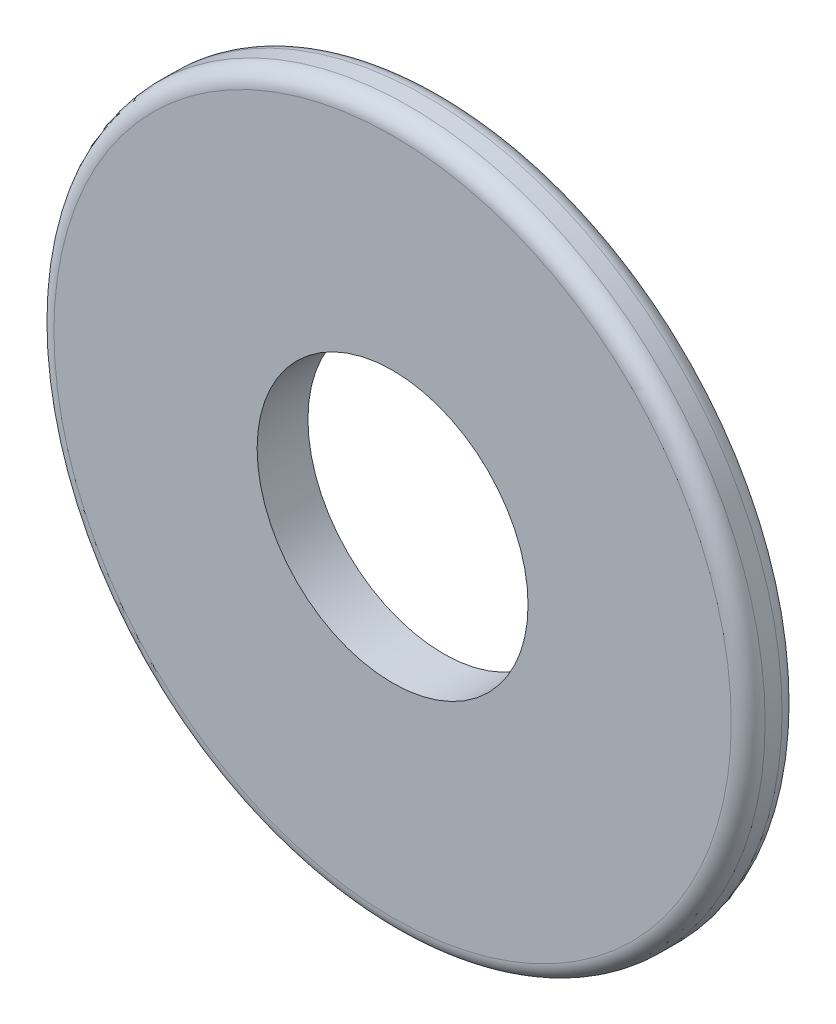
ISO-10303-21;
HEADER;
FILE_DESCRIPTION(('STEP AP214'),'2;1');
FILE_NAME('part.step','',(''),(''),'','','');
FILE_SCHEMA(('AUTOMOTIVE_DESIGN { 1 0 10303 214 1 1 1 1 }'));
ENDSEC;
DATA;
#1=APPLICATION_CONTEXT('core data for automotive mechanical design processes');
#2=APPLICATION_PROTOCOL_DEFINITION('international standard','automotive_design',2000,#1);
#3=PRODUCT_CONTEXT('',#1,'mechanical');
#4=PRODUCT('Part','Part','',(#3));
#5=PRODUCT_RELATED_PRODUCT_CATEGORY('part','',(#4));
#6=PRODUCT_DEFINITION_FORMATION('','',#4);
#7=PRODUCT_DEFINITION_CONTEXT('part definition',#1,'design');
#8=PRODUCT_DEFINITION('design','',#6,#7);
#9=PRODUCT_DEFINITION_SHAPE('','',#8);
#10=(LENGTH_UNIT() NAMED_UNIT(*) SI_UNIT(.MILLI.,.METRE.));
#11=(NAMED_UNIT(*) PLANE_ANGLE_UNIT() SI_UNIT($,.RADIAN.));
#12=(NAMED_UNIT(*) SI_UNIT($,.STERADIAN.) SOLID_ANGLE_UNIT());
#13=UNCERTAINTY_MEASURE_WITH_UNIT(LENGTH_MEASURE(1.E-05),#10,'distance_accuracy_value','');
#14=(GEOMETRIC_REPRESENTATION_CONTEXT(3) GLOBAL_UNCERTAINTY_ASSIGNED_CONTEXT((#13)) GLOBAL_UNIT_ASSIGNED_CONTEXT((#10,
#11,#12)) REPRESENTATION_CONTEXT('',''));
#15=CARTESIAN_POINT('',(0.,0.,0.));
#16=DIRECTION('',(0.,0.,1.));
#17=DIRECTION('',(1.,0.,0.));
#18=AXIS2_PLACEMENT_3D('',#15,#16,#17);
#19=CARTESIAN_POINT('',(0.,0.,1.5));
#20=DIRECTION('',(0.,0.,1.));
#21=DIRECTION('',(1.,0.,0.));
#22=AXIS2_PLACEMENT_3D('',#19,#20,#21);
#23=PLANE('',#22);
#24=CARTESIAN_POINT('',(0.,0.,1.5));
#25=DIRECTION('',(0.,0.,1.));
#26=DIRECTION('',(1.,0.,0.));
#27=AXIS2_PLACEMENT_3D('',#24,#25,#26);
#28=CIRCLE('',#27,10.);
#29=CARTESIAN_POINT('',(10.,0.,1.5));
#30=VERTEX_POINT('',#29);
#31=EDGE_CURVE('E10',#30,#30,#28,.T.);
#32=ORIENTED_EDGE('',*,*,#31,.T.);
#33=EDGE_LOOP('',(#32));
#34=FACE_BOUND('',#33,.T.);
#35=CARTESIAN_POINT('',(0.,0.,1.5));
#36=DIRECTION('',(0.,0.,1.));
#37=DIRECTION('',(1.,0.,0.));
#38=AXIS2_PLACEMENT_3D('',#35,#36,#37);
#39=CIRCLE('',#38,4.);
#40=CARTESIAN_POINT('',(4.,0.,1.5));
#41=VERTEX_POINT('',#40);
#42=EDGE_CURVE('E70',#41,#41,#39,.T.);
#43=ORIENTED_EDGE('',*,*,#42,.F.);
#44=EDGE_LOOP('',(#43));
#45=FACE_BOUND('',#44,.T.);
#46=ADVANCED_FACE('F43',(#34,#45),#23,.T.);
#47=CARTESIAN_POINT('',(0.,0.,0.));
#48=DIRECTION('',(0.,0.,1.));
#49=DIRECTION('',(1.,0.,0.));
#50=AXIS2_PLACEMENT_3D('',#47,#48,#49);
#51=PLANE('',#50);
#52=CARTESIAN_POINT('',(0.,0.,0.));
#53=DIRECTION('',(0.,0.,1.));
#54=DIRECTION('',(1.,0.,0.));
#55=AXIS2_PLACEMENT_3D('',#52,#53,#54);
#56=CIRCLE('',#55,10.);
#57=CARTESIAN_POINT('',(10.,0.,0.));
#58=VERTEX_POINT('',#57);
#59=EDGE_CURVE('E51',#58,#58,#56,.F.);
#60=ORIENTED_EDGE('',*,*,#59,.T.);
#61=EDGE_LOOP('',(#60));
#62=FACE_BOUND('',#61,.T.);
#63=CARTESIAN_POINT('',(0.,0.,0.));
#64=DIRECTION('',(0.,0.,1.));
#65=DIRECTION('',(1.,0.,0.));
#66=AXIS2_PLACEMENT_3D('',#63,#64,#65);
#67=CIRCLE('',#66,4.);
#68=CARTESIAN_POINT('',(4.,0.,0.));
#69=VERTEX_POINT('',#68);
#70=EDGE_CURVE('E68',#69,#69,#67,.T.);
#71=ORIENTED_EDGE('',*,*,#70,.T.);
#72=EDGE_LOOP('',(#71));
#73=FACE_BOUND('',#72,.T.);
#74=ADVANCED_FACE('F78',(#62,#73),#51,.F.);
#75=CARTESIAN_POINT('',(0.,0.,1.5));
#76=DIRECTION('',(0.,0.,-1.));
#77=DIRECTION('',(-1.,0.,0.));
#78=AXIS2_PLACEMENT_3D('',#75,#76,#77);
#79=CYLINDRICAL_SURFACE('',#78,10.5);
#80=CARTESIAN_POINT('',(0.,0.,0.5));
#81=DIRECTION('',(0.,0.,1.));
#82=DIRECTION('',(1.,0.,0.));
#83=AXIS2_PLACEMENT_3D('',#80,#81,#82);
#84=CIRCLE('',#83,10.5);
#85=CARTESIAN_POINT('',(10.5,0.,0.5));
#86=VERTEX_POINT('',#85);
#87=EDGE_CURVE('E57',#86,#86,#84,.T.);
#88=ORIENTED_EDGE('',*,*,#87,.T.);
#89=EDGE_LOOP('',(#88));
#90=FACE_BOUND('',#89,.T.);
#91=CARTESIAN_POINT('',(0.,0.,1.));
#92=DIRECTION('',(0.,0.,1.));
#93=DIRECTION('',(1.,0.,0.));
#94=AXIS2_PLACEMENT_3D('',#91,#92,#93);
#95=CIRCLE('',#94,10.5);
#96=CARTESIAN_POINT('',(10.5,0.,1.));
#97=VERTEX_POINT('',#96);
#98=EDGE_CURVE('E62',#97,#97,#95,.F.);
#99=ORIENTED_EDGE('',*,*,#98,.T.);
#100=EDGE_LOOP('',(#99));
#101=FACE_BOUND('',#100,.T.);
#102=ADVANCED_FACE('F88',(#90,#101),#79,.T.);
#103=CARTESIAN_POINT('',(0.,0.,1.5));
#104=DIRECTION('',(0.,0.,-1.));
#105=DIRECTION('',(-1.,0.,0.));
#106=AXIS2_PLACEMENT_3D('',#103,#104,#105);
#107=CYLINDRICAL_SURFACE('',#106,4.);
#108=ORIENTED_EDGE('',*,*,#42,.T.);
#109=EDGE_LOOP('',(#108));
#110=FACE_BOUND('',#109,.T.);
#111=ORIENTED_EDGE('',*,*,#70,.F.);
#112=EDGE_LOOP('',(#111));
#113=FACE_BOUND('',#112,.T.);
#114=ADVANCED_FACE('F77',(#110,#113),#107,.F.);
#115=CARTESIAN_POINT('',(0.,0.,0.5));
#116=DIRECTION('',(0.,0.,1.));
#117=DIRECTION('',(1.,0.,0.));
#118=AXIS2_PLACEMENT_3D('',#115,#116,#117);
#119=TOROIDAL_SURFACE('',#118,10.,0.5);
#120=ORIENTED_EDGE('',*,*,#59,.F.);
#121=EDGE_LOOP('',(#120));
#122=FACE_BOUND('',#121,.T.);
#123=ORIENTED_EDGE('',*,*,#87,.F.);
#124=EDGE_LOOP('',(#123));
#125=FACE_BOUND('',#124,.T.);
#126=ADVANCED_FACE('F95',(#122,#125),#119,.T.);
#127=CARTESIAN_POINT('',(0.,0.,1.));
#128=DIRECTION('',(0.,0.,1.));
#129=DIRECTION('',(1.,0.,0.));
#130=AXIS2_PLACEMENT_3D('',#127,#128,#129);
#131=TOROIDAL_SURFACE('',#130,10.,0.5);
#132=ORIENTED_EDGE('',*,*,#98,.F.);
#133=EDGE_LOOP('',(#132));
#134=FACE_BOUND('',#133,.T.);
#135=ORIENTED_EDGE('',*,*,#31,.F.);
#136=EDGE_LOOP('',(#135));
#137=FACE_BOUND('',#136,.T.);
#138=ADVANCED_FACE('F44',(#134,#137),#131,.T.);
#139=CLOSED_SHELL('',(#46,#74,#102,#114,#126,#138));
#140=MANIFOLD_SOLID_BREP('B2',#139);
#141=ADVANCED_BREP_SHAPE_REPRESENTATION('',(#18,#140),#14);
#142=SHAPE_DEFINITION_REPRESENTATION(#9,#141);
ENDSEC;
END-ISO-10303-21;
